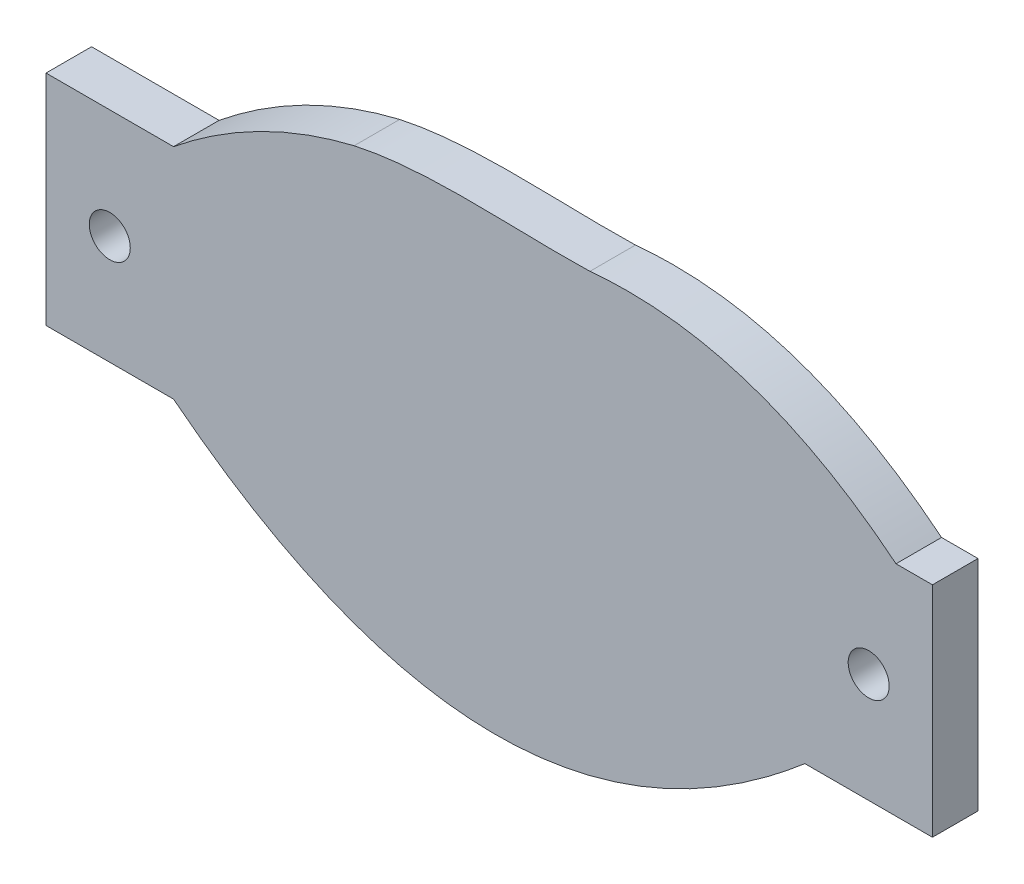
ISO-10303-21;
HEADER;
FILE_DESCRIPTION(('STEP AP214'),'2;1');
FILE_NAME('part.step','',(''),(''),'','','');
FILE_SCHEMA(('AUTOMOTIVE_DESIGN { 1 0 10303 214 1 1 1 1 }'));
ENDSEC;
DATA;
#1=APPLICATION_CONTEXT('core data for automotive mechanical design processes');
#2=APPLICATION_PROTOCOL_DEFINITION('international standard','automotive_design',2000,#1);
#3=PRODUCT_CONTEXT('',#1,'mechanical');
#4=PRODUCT('Part','Part','',(#3));
#5=PRODUCT_RELATED_PRODUCT_CATEGORY('part','',(#4));
#6=PRODUCT_DEFINITION_FORMATION('','',#4);
#7=PRODUCT_DEFINITION_CONTEXT('part definition',#1,'design');
#8=PRODUCT_DEFINITION('design','',#6,#7);
#9=PRODUCT_DEFINITION_SHAPE('','',#8);
#10=(LENGTH_UNIT() NAMED_UNIT(*) SI_UNIT(.MILLI.,.METRE.));
#11=(NAMED_UNIT(*) PLANE_ANGLE_UNIT() SI_UNIT($,.RADIAN.));
#12=(NAMED_UNIT(*) SI_UNIT($,.STERADIAN.) SOLID_ANGLE_UNIT());
#13=UNCERTAINTY_MEASURE_WITH_UNIT(LENGTH_MEASURE(1.E-05),#10,'distance_accuracy_value','');
#14=(GEOMETRIC_REPRESENTATION_CONTEXT(3) GLOBAL_UNCERTAINTY_ASSIGNED_CONTEXT((#13)) GLOBAL_UNIT_ASSIGNED_CONTEXT((#10,
#11,#12)) REPRESENTATION_CONTEXT('',''));
#15=CARTESIAN_POINT('',(0.,0.,0.));
#16=DIRECTION('',(0.,0.,1.));
#17=DIRECTION('',(1.,0.,0.));
#18=AXIS2_PLACEMENT_3D('',#15,#16,#17);
#19=CARTESIAN_POINT('',(42.3737110695465,-26.2176725913239,5.));
#20=DIRECTION('',(0.,0.,-1.));
#21=DIRECTION('',(-1.,0.,0.));
#22=AXIS2_PLACEMENT_3D('',#19,#20,#21);
#23=PLANE('',#22);
#24=DIRECTION('',(0.,-1.,0.));
#25=VECTOR('',#24,1.);
#26=CARTESIAN_POINT('',(-7.,12.,5.));
#27=LINE('',#26,#25);
#28=CARTESIAN_POINT('',(-7.,12.,5.));
#29=VERTEX_POINT('',#28);
#30=CARTESIAN_POINT('',(-7.,-12.,5.));
#31=VERTEX_POINT('',#30);
#32=EDGE_CURVE('E253',#29,#31,#27,.T.);
#33=ORIENTED_EDGE('',*,*,#32,.T.);
#34=DIRECTION('',(1.,0.,0.));
#35=VECTOR('',#34,1.);
#36=CARTESIAN_POINT('',(7.,-12.,5.));
#37=LINE('',#36,#35);
#38=CARTESIAN_POINT('',(7.,-12.,5.));
#39=VERTEX_POINT('',#38);
#40=EDGE_CURVE('E106',#31,#39,#37,.T.);
#41=ORIENTED_EDGE('',*,*,#40,.T.);
#42=CARTESIAN_POINT('',(7.,-12.,5.));
#43=CARTESIAN_POINT('',(43.097422139093,-40.4353451826478,5.));
#44=CARTESIAN_POINT('',(76.3,-12.,5.));
#45=B_SPLINE_CURVE_WITH_KNOTS('',2,(#42,#43,#44),.UNSPECIFIED.,.F.,.F.,(3,3),(0.,1.),.UNSPECIFIED.);
#46=CARTESIAN_POINT('',(76.3,-12.,5.));
#47=VERTEX_POINT('',#46);
#48=EDGE_CURVE('E193',#39,#47,#45,.T.);
#49=ORIENTED_EDGE('',*,*,#48,.T.);
#50=DIRECTION('',(1.,0.,0.));
#51=VECTOR('',#50,1.);
#52=CARTESIAN_POINT('',(90.3,-12.,5.));
#53=LINE('',#52,#51);
#54=CARTESIAN_POINT('',(90.3,-12.,5.));
#55=VERTEX_POINT('',#54);
#56=EDGE_CURVE('E190',#47,#55,#53,.T.);
#57=ORIENTED_EDGE('',*,*,#56,.T.);
#58=DIRECTION('',(0.,1.,0.));
#59=VECTOR('',#58,1.);
#60=CARTESIAN_POINT('',(90.3,12.,5.));
#61=LINE('',#60,#59);
#62=CARTESIAN_POINT('',(90.3,12.,5.));
#63=VERTEX_POINT('',#62);
#64=EDGE_CURVE('E187',#55,#63,#61,.T.);
#65=ORIENTED_EDGE('',*,*,#64,.T.);
#66=DIRECTION('',(-1.,0.,0.));
#67=VECTOR('',#66,1.);
#68=CARTESIAN_POINT('',(90.3,12.,5.));
#69=LINE('',#68,#67);
#70=CARTESIAN_POINT('',(86.3,12.,5.));
#71=VERTEX_POINT('',#70);
#72=EDGE_CURVE('E181',#63,#71,#69,.T.);
#73=ORIENTED_EDGE('',*,*,#72,.T.);
#74=CARTESIAN_POINT('',(86.3000000000002,12.,5.));
#75=CARTESIAN_POINT('',(70.621114072104,24.7032963437799,5.));
#76=CARTESIAN_POINT('',(52.7027533434082,23.,5.));
#77=B_SPLINE_CURVE_WITH_KNOTS('',2,(#74,#75,#76),.UNSPECIFIED.,.F.,.F.,(3,3),(0.,1.),.UNSPECIFIED.);
#78=CARTESIAN_POINT('',(52.7027533434082,23.,5.));
#79=VERTEX_POINT('',#78);
#80=EDGE_CURVE('E131',#71,#79,#77,.T.);
#81=ORIENTED_EDGE('',*,*,#80,.T.);
#82=CARTESIAN_POINT('',(52.7027533434082,23.,5.));
#83=CARTESIAN_POINT('',(44.092421980205,22.7789478344238,5.));
#84=CARTESIAN_POINT('',(35.180728241993,23.8294814554729,5.));
#85=CARTESIAN_POINT('',(26.825,22.,5.));
#86=B_SPLINE_CURVE_WITH_KNOTS('',3,(#82,#83,#84,#85),.UNSPECIFIED.,.F.,.F.,(4,4),(0.,
0.489996711552598),.UNSPECIFIED.);
#87=CARTESIAN_POINT('',(26.825,22.,5.));
#88=VERTEX_POINT('',#87);
#89=EDGE_CURVE('E125',#79,#88,#86,.T.);
#90=ORIENTED_EDGE('',*,*,#89,.T.);
#91=CARTESIAN_POINT('',(26.825,22.,5.));
#92=CARTESIAN_POINT('',(16.1529989573886,19.4342453643305,5.));
#93=CARTESIAN_POINT('',(7.,12.,5.));
#94=B_SPLINE_CURVE_WITH_KNOTS('',2,(#91,#92,#93),.UNSPECIFIED.,.F.,.F.,(3,3),(0.,
0.53349915690995),.UNSPECIFIED.);
#95=CARTESIAN_POINT('',(7.,12.,5.));
#96=VERTEX_POINT('',#95);
#97=EDGE_CURVE('E129',#88,#96,#94,.T.);
#98=ORIENTED_EDGE('',*,*,#97,.T.);
#99=DIRECTION('',(-1.,0.,0.));
#100=VECTOR('',#99,1.);
#101=CARTESIAN_POINT('',(7.,12.,5.));
#102=LINE('',#101,#100);
#103=EDGE_CURVE('E57',#96,#29,#102,.T.);
#104=ORIENTED_EDGE('',*,*,#103,.T.);
#105=EDGE_LOOP('',(#33,#41,#49,#57,#65,#73,#81,#90,#98,#104));
#106=FACE_BOUND('',#105,.T.);
#107=CARTESIAN_POINT('',(0.,0.,5.));
#108=DIRECTION('',(0.,0.,1.));
#109=DIRECTION('',(1.,0.,0.));
#110=AXIS2_PLACEMENT_3D('',#107,#108,#109);
#111=CIRCLE('',#110,2.25);
#112=CARTESIAN_POINT('',(2.25,0.,5.));
#113=VERTEX_POINT('',#112);
#114=EDGE_CURVE('E246',#113,#113,#111,.T.);
#115=ORIENTED_EDGE('',*,*,#114,.F.);
#116=EDGE_LOOP('',(#115));
#117=FACE_BOUND('',#116,.T.);
#118=CARTESIAN_POINT('',(83.3,0.,5.));
#119=DIRECTION('',(0.,0.,1.));
#120=DIRECTION('',(1.,0.,0.));
#121=AXIS2_PLACEMENT_3D('',#118,#119,#120);
#122=CIRCLE('',#121,2.25);
#123=CARTESIAN_POINT('',(85.55,0.,5.));
#124=VERTEX_POINT('',#123);
#125=EDGE_CURVE('E235',#124,#124,#122,.T.);
#126=ORIENTED_EDGE('',*,*,#125,.F.);
#127=EDGE_LOOP('',(#126));
#128=FACE_BOUND('',#127,.T.);
#129=ADVANCED_FACE('F39',(#106,#117,#128),#23,.F.);
#130=CARTESIAN_POINT('',(42.3737110695465,-26.2176725913239,0.));
#131=DIRECTION('',(0.,0.,-1.));
#132=DIRECTION('',(-1.,0.,0.));
#133=AXIS2_PLACEMENT_3D('',#130,#131,#132);
#134=PLANE('',#133);
#135=CARTESIAN_POINT('',(0.,0.,0.));
#136=DIRECTION('',(0.,0.,1.));
#137=DIRECTION('',(1.,0.,0.));
#138=AXIS2_PLACEMENT_3D('',#135,#136,#137);
#139=CIRCLE('',#138,2.25);
#140=CARTESIAN_POINT('',(2.25,0.,0.));
#141=VERTEX_POINT('',#140);
#142=EDGE_CURVE('E243',#141,#141,#139,.T.);
#143=ORIENTED_EDGE('',*,*,#142,.T.);
#144=EDGE_LOOP('',(#143));
#145=FACE_BOUND('',#144,.T.);
#146=DIRECTION('',(0.,-1.,0.));
#147=VECTOR('',#146,1.);
#148=CARTESIAN_POINT('',(-7.,12.,0.));
#149=LINE('',#148,#147);
#150=CARTESIAN_POINT('',(-7.,12.,0.));
#151=VERTEX_POINT('',#150);
#152=CARTESIAN_POINT('',(-7.,-12.,0.));
#153=VERTEX_POINT('',#152);
#154=EDGE_CURVE('E250',#151,#153,#149,.T.);
#155=ORIENTED_EDGE('',*,*,#154,.F.);
#156=DIRECTION('',(-1.,0.,0.));
#157=VECTOR('',#156,1.);
#158=CARTESIAN_POINT('',(7.,12.,0.));
#159=LINE('',#158,#157);
#160=CARTESIAN_POINT('',(7.,12.,0.));
#161=VERTEX_POINT('',#160);
#162=EDGE_CURVE('E98',#161,#151,#159,.T.);
#163=ORIENTED_EDGE('',*,*,#162,.F.);
#164=CARTESIAN_POINT('',(26.825,22.,0.));
#165=CARTESIAN_POINT('',(16.1529989573886,19.4342453643305,0.));
#166=CARTESIAN_POINT('',(7.,12.,0.));
#167=B_SPLINE_CURVE_WITH_KNOTS('',2,(#164,#165,#166),.UNSPECIFIED.,.F.,.F.,(3,3),(0.,
0.53349915690995),.UNSPECIFIED.);
#168=CARTESIAN_POINT('',(26.825,22.,0.));
#169=VERTEX_POINT('',#168);
#170=EDGE_CURVE('E92',#169,#161,#167,.T.);
#171=ORIENTED_EDGE('',*,*,#170,.F.);
#172=CARTESIAN_POINT('',(52.7027533434082,23.,0.));
#173=CARTESIAN_POINT('',(44.092421980205,22.7789478344238,0.));
#174=CARTESIAN_POINT('',(35.180728241993,23.8294814554729,0.));
#175=CARTESIAN_POINT('',(26.825,22.,0.));
#176=B_SPLINE_CURVE_WITH_KNOTS('',3,(#172,#173,#174,#175),.UNSPECIFIED.,.F.,.F.,(4,4),(0.,
0.489996711552598),.UNSPECIFIED.);
#177=CARTESIAN_POINT('',(52.7027533434082,23.,0.));
#178=VERTEX_POINT('',#177);
#179=EDGE_CURVE('E140',#178,#169,#176,.T.);
#180=ORIENTED_EDGE('',*,*,#179,.F.);
#181=CARTESIAN_POINT('',(86.3000000000002,12.,0.));
#182=CARTESIAN_POINT('',(70.621114072104,24.7032963437799,0.));
#183=CARTESIAN_POINT('',(52.7027533434082,23.,0.));
#184=B_SPLINE_CURVE_WITH_KNOTS('',2,(#181,#182,#183),.UNSPECIFIED.,.F.,.F.,(3,3),(0.,1.),.UNSPECIFIED.);
#185=CARTESIAN_POINT('',(86.3,12.,0.));
#186=VERTEX_POINT('',#185);
#187=EDGE_CURVE('E317',#186,#178,#184,.T.);
#188=ORIENTED_EDGE('',*,*,#187,.F.);
#189=DIRECTION('',(-1.,0.,0.));
#190=VECTOR('',#189,1.);
#191=CARTESIAN_POINT('',(90.3,12.,0.));
#192=LINE('',#191,#190);
#193=CARTESIAN_POINT('',(90.3,12.,0.));
#194=VERTEX_POINT('',#193);
#195=EDGE_CURVE('E314',#194,#186,#192,.T.);
#196=ORIENTED_EDGE('',*,*,#195,.F.);
#197=DIRECTION('',(0.,1.,0.));
#198=VECTOR('',#197,1.);
#199=CARTESIAN_POINT('',(90.3,12.,0.));
#200=LINE('',#199,#198);
#201=CARTESIAN_POINT('',(90.3,-12.,0.));
#202=VERTEX_POINT('',#201);
#203=EDGE_CURVE('E303',#202,#194,#200,.T.);
#204=ORIENTED_EDGE('',*,*,#203,.F.);
#205=DIRECTION('',(1.,0.,0.));
#206=VECTOR('',#205,1.);
#207=CARTESIAN_POINT('',(90.3,-12.,0.));
#208=LINE('',#207,#206);
#209=CARTESIAN_POINT('',(76.3,-12.,0.));
#210=VERTEX_POINT('',#209);
#211=EDGE_CURVE('E298',#210,#202,#208,.T.);
#212=ORIENTED_EDGE('',*,*,#211,.F.);
#213=CARTESIAN_POINT('',(7.,-12.,0.));
#214=CARTESIAN_POINT('',(43.097422139093,-40.4353451826478,0.));
#215=CARTESIAN_POINT('',(76.3,-12.,0.));
#216=B_SPLINE_CURVE_WITH_KNOTS('',2,(#213,#214,#215),.UNSPECIFIED.,.F.,.F.,(3,3),(0.,1.),.UNSPECIFIED.);
#217=CARTESIAN_POINT('',(7.,-12.,0.));
#218=VERTEX_POINT('',#217);
#219=EDGE_CURVE('E292',#218,#210,#216,.T.);
#220=ORIENTED_EDGE('',*,*,#219,.F.);
#221=DIRECTION('',(1.,0.,0.));
#222=VECTOR('',#221,1.);
#223=CARTESIAN_POINT('',(7.,-12.,0.));
#224=LINE('',#223,#222);
#225=EDGE_CURVE('E296',#153,#218,#224,.T.);
#226=ORIENTED_EDGE('',*,*,#225,.F.);
#227=EDGE_LOOP('',(#155,#163,#171,#180,#188,#196,#204,#212,#220,#226));
#228=FACE_BOUND('',#227,.T.);
#229=CARTESIAN_POINT('',(83.3,0.,0.));
#230=DIRECTION('',(0.,0.,1.));
#231=DIRECTION('',(1.,0.,0.));
#232=AXIS2_PLACEMENT_3D('',#229,#230,#231);
#233=CIRCLE('',#232,2.25);
#234=CARTESIAN_POINT('',(85.55,0.,0.));
#235=VERTEX_POINT('',#234);
#236=EDGE_CURVE('E238',#235,#235,#233,.T.);
#237=ORIENTED_EDGE('',*,*,#236,.T.);
#238=EDGE_LOOP('',(#237));
#239=FACE_BOUND('',#238,.T.);
#240=ADVANCED_FACE('F214',(#145,#228,#239),#134,.T.);
#241=CARTESIAN_POINT('',(-7.,12.,5.));
#242=DIRECTION('',(1.,0.,0.));
#243=DIRECTION('',(0.,1.,0.));
#244=AXIS2_PLACEMENT_3D('',#241,#242,#243);
#245=PLANE('',#244);
#246=ORIENTED_EDGE('',*,*,#154,.T.);
#247=DIRECTION('',(0.,0.,-1.));
#248=VECTOR('',#247,1.);
#249=CARTESIAN_POINT('',(-7.,-12.,5.));
#250=LINE('',#249,#248);
#251=EDGE_CURVE('E11',#31,#153,#250,.T.);
#252=ORIENTED_EDGE('',*,*,#251,.F.);
#253=ORIENTED_EDGE('',*,*,#32,.F.);
#254=DIRECTION('',(0.,0.,-1.));
#255=VECTOR('',#254,1.);
#256=CARTESIAN_POINT('',(-7.,12.,5.));
#257=LINE('',#256,#255);
#258=EDGE_CURVE('E149',#29,#151,#257,.T.);
#259=ORIENTED_EDGE('',*,*,#258,.T.);
#260=EDGE_LOOP('',(#246,#252,#253,#259));
#261=FACE_BOUND('',#260,.T.);
#262=ADVANCED_FACE('F41',(#261),#245,.F.);
#263=CARTESIAN_POINT('',(7.,-12.,5.));
#264=DIRECTION('',(0.,1.,0.));
#265=DIRECTION('',(0.,0.,1.));
#266=AXIS2_PLACEMENT_3D('',#263,#264,#265);
#267=PLANE('',#266);
#268=ORIENTED_EDGE('',*,*,#225,.T.);
#269=DIRECTION('',(0.,0.,-1.));
#270=VECTOR('',#269,1.);
#271=CARTESIAN_POINT('',(7.,-12.,5.));
#272=LINE('',#271,#270);
#273=EDGE_CURVE('E49',#39,#218,#272,.T.);
#274=ORIENTED_EDGE('',*,*,#273,.F.);
#275=ORIENTED_EDGE('',*,*,#40,.F.);
#276=ORIENTED_EDGE('',*,*,#251,.T.);
#277=EDGE_LOOP('',(#268,#274,#275,#276));
#278=FACE_BOUND('',#277,.T.);
#279=ADVANCED_FACE('F208',(#278),#267,.F.);
#280=DIRECTION('',(0.,0.,-1.));
#281=VECTOR('',#280,1.);
#282=SURFACE_OF_LINEAR_EXTRUSION('',#45,#281);
#283=ORIENTED_EDGE('',*,*,#219,.T.);
#284=DIRECTION('',(0.,0.,-1.));
#285=VECTOR('',#284,1.);
#286=CARTESIAN_POINT('',(76.3,-12.,5.));
#287=LINE('',#286,#285);
#288=EDGE_CURVE('E284',#47,#210,#287,.T.);
#289=ORIENTED_EDGE('',*,*,#288,.F.);
#290=ORIENTED_EDGE('',*,*,#48,.F.);
#291=ORIENTED_EDGE('',*,*,#273,.T.);
#292=EDGE_LOOP('',(#283,#289,#290,#291));
#293=FACE_BOUND('',#292,.T.);
#294=ADVANCED_FACE('F204',(#293),#282,.F.);
#295=CARTESIAN_POINT('',(90.3,-12.,5.));
#296=DIRECTION('',(0.,1.,0.));
#297=DIRECTION('',(-1.,0.,0.));
#298=AXIS2_PLACEMENT_3D('',#295,#296,#297);
#299=PLANE('',#298);
#300=ORIENTED_EDGE('',*,*,#211,.T.);
#301=DIRECTION('',(0.,0.,-1.));
#302=VECTOR('',#301,1.);
#303=CARTESIAN_POINT('',(90.3,-12.,5.));
#304=LINE('',#303,#302);
#305=EDGE_CURVE('E280',#55,#202,#304,.T.);
#306=ORIENTED_EDGE('',*,*,#305,.F.);
#307=ORIENTED_EDGE('',*,*,#56,.F.);
#308=ORIENTED_EDGE('',*,*,#288,.T.);
#309=EDGE_LOOP('',(#300,#306,#307,#308));
#310=FACE_BOUND('',#309,.T.);
#311=ADVANCED_FACE('F207',(#310),#299,.F.);
#312=CARTESIAN_POINT('',(90.3,12.,5.));
#313=DIRECTION('',(-1.,0.,0.));
#314=DIRECTION('',(0.,0.,1.));
#315=AXIS2_PLACEMENT_3D('',#312,#313,#314);
#316=PLANE('',#315);
#317=ORIENTED_EDGE('',*,*,#203,.T.);
#318=DIRECTION('',(0.,0.,-1.));
#319=VECTOR('',#318,1.);
#320=CARTESIAN_POINT('',(90.3,12.,5.));
#321=LINE('',#320,#319);
#322=EDGE_CURVE('E276',#63,#194,#321,.T.);
#323=ORIENTED_EDGE('',*,*,#322,.F.);
#324=ORIENTED_EDGE('',*,*,#64,.F.);
#325=ORIENTED_EDGE('',*,*,#305,.T.);
#326=EDGE_LOOP('',(#317,#323,#324,#325));
#327=FACE_BOUND('',#326,.T.);
#328=ADVANCED_FACE('F374',(#327),#316,.F.);
#329=CARTESIAN_POINT('',(90.3,12.,5.));
#330=DIRECTION('',(0.,-1.,0.));
#331=DIRECTION('',(1.,0.,0.));
#332=AXIS2_PLACEMENT_3D('',#329,#330,#331);
#333=PLANE('',#332);
#334=ORIENTED_EDGE('',*,*,#195,.T.);
#335=DIRECTION('',(0.,0.,-1.));
#336=VECTOR('',#335,1.);
#337=CARTESIAN_POINT('',(86.3,12.,5.));
#338=LINE('',#337,#336);
#339=EDGE_CURVE('E272',#71,#186,#338,.T.);
#340=ORIENTED_EDGE('',*,*,#339,.F.);
#341=ORIENTED_EDGE('',*,*,#72,.F.);
#342=ORIENTED_EDGE('',*,*,#322,.T.);
#343=EDGE_LOOP('',(#334,#340,#341,#342));
#344=FACE_BOUND('',#343,.T.);
#345=ADVANCED_FACE('F173',(#344),#333,.F.);
#346=DIRECTION('',(0.,0.,-1.));
#347=VECTOR('',#346,1.);
#348=SURFACE_OF_LINEAR_EXTRUSION('',#77,#347);
#349=ORIENTED_EDGE('',*,*,#187,.T.);
#350=DIRECTION('',(0.,0.,-1.));
#351=VECTOR('',#350,1.);
#352=CARTESIAN_POINT('',(52.7027533434082,23.,5.));
#353=LINE('',#352,#351);
#354=EDGE_CURVE('E142',#79,#178,#353,.T.);
#355=ORIENTED_EDGE('',*,*,#354,.F.);
#356=ORIENTED_EDGE('',*,*,#80,.F.);
#357=ORIENTED_EDGE('',*,*,#339,.T.);
#358=EDGE_LOOP('',(#349,#355,#356,#357));
#359=FACE_BOUND('',#358,.T.);
#360=ADVANCED_FACE('F170',(#359),#348,.F.);
#361=DIRECTION('',(0.,0.,-1.));
#362=VECTOR('',#361,1.);
#363=SURFACE_OF_LINEAR_EXTRUSION('',#86,#362);
#364=ORIENTED_EDGE('',*,*,#179,.T.);
#365=DIRECTION('',(0.,0.,-1.));
#366=VECTOR('',#365,1.);
#367=CARTESIAN_POINT('',(26.825,22.,5.));
#368=LINE('',#367,#366);
#369=EDGE_CURVE('E137',#88,#169,#368,.T.);
#370=ORIENTED_EDGE('',*,*,#369,.F.);
#371=ORIENTED_EDGE('',*,*,#89,.F.);
#372=ORIENTED_EDGE('',*,*,#354,.T.);
#373=EDGE_LOOP('',(#364,#370,#371,#372));
#374=FACE_BOUND('',#373,.T.);
#375=ADVANCED_FACE('F138',(#374),#363,.F.);
#376=DIRECTION('',(0.,0.,-1.));
#377=VECTOR('',#376,1.);
#378=SURFACE_OF_LINEAR_EXTRUSION('',#94,#377);
#379=ORIENTED_EDGE('',*,*,#170,.T.);
#380=DIRECTION('',(0.,0.,-1.));
#381=VECTOR('',#380,1.);
#382=CARTESIAN_POINT('',(7.,12.,5.));
#383=LINE('',#382,#381);
#384=EDGE_CURVE('E143',#96,#161,#383,.T.);
#385=ORIENTED_EDGE('',*,*,#384,.F.);
#386=ORIENTED_EDGE('',*,*,#97,.F.);
#387=ORIENTED_EDGE('',*,*,#369,.T.);
#388=EDGE_LOOP('',(#379,#385,#386,#387));
#389=FACE_BOUND('',#388,.T.);
#390=ADVANCED_FACE('F145',(#389),#378,.F.);
#391=CARTESIAN_POINT('',(7.,12.,5.));
#392=DIRECTION('',(0.,-1.,0.));
#393=DIRECTION('',(0.,0.,-1.));
#394=AXIS2_PLACEMENT_3D('',#391,#392,#393);
#395=PLANE('',#394);
#396=ORIENTED_EDGE('',*,*,#162,.T.);
#397=ORIENTED_EDGE('',*,*,#258,.F.);
#398=ORIENTED_EDGE('',*,*,#103,.F.);
#399=ORIENTED_EDGE('',*,*,#384,.T.);
#400=EDGE_LOOP('',(#396,#397,#398,#399));
#401=FACE_BOUND('',#400,.T.);
#402=ADVANCED_FACE('F166',(#401),#395,.F.);
#403=CARTESIAN_POINT('',(0.,0.,5.));
#404=DIRECTION('',(0.,0.,-1.));
#405=DIRECTION('',(-1.,0.,0.));
#406=AXIS2_PLACEMENT_3D('',#403,#404,#405);
#407=CYLINDRICAL_SURFACE('',#406,2.25);
#408=ORIENTED_EDGE('',*,*,#114,.T.);
#409=EDGE_LOOP('',(#408));
#410=FACE_BOUND('',#409,.T.);
#411=ORIENTED_EDGE('',*,*,#142,.F.);
#412=EDGE_LOOP('',(#411));
#413=FACE_BOUND('',#412,.T.);
#414=ADVANCED_FACE('F223',(#410,#413),#407,.F.);
#415=CARTESIAN_POINT('',(83.3,0.,5.));
#416=DIRECTION('',(0.,0.,-1.));
#417=DIRECTION('',(-1.,0.,0.));
#418=AXIS2_PLACEMENT_3D('',#415,#416,#417);
#419=CYLINDRICAL_SURFACE('',#418,2.25);
#420=ORIENTED_EDGE('',*,*,#125,.T.);
#421=EDGE_LOOP('',(#420));
#422=FACE_BOUND('',#421,.T.);
#423=ORIENTED_EDGE('',*,*,#236,.F.);
#424=EDGE_LOOP('',(#423));
#425=FACE_BOUND('',#424,.T.);
#426=ADVANCED_FACE('F226',(#422,#425),#419,.F.);
#427=CLOSED_SHELL('',(#129,#240,#262,#279,#294,#311,#328,#345,#360,#375,#390,#402,#414,#426));
#428=MANIFOLD_SOLID_BREP('B2',#427);
#429=ADVANCED_BREP_SHAPE_REPRESENTATION('',(#18,#428),#14);
#430=SHAPE_DEFINITION_REPRESENTATION(#9,#429);
ENDSEC;
END-ISO-10303-21;
